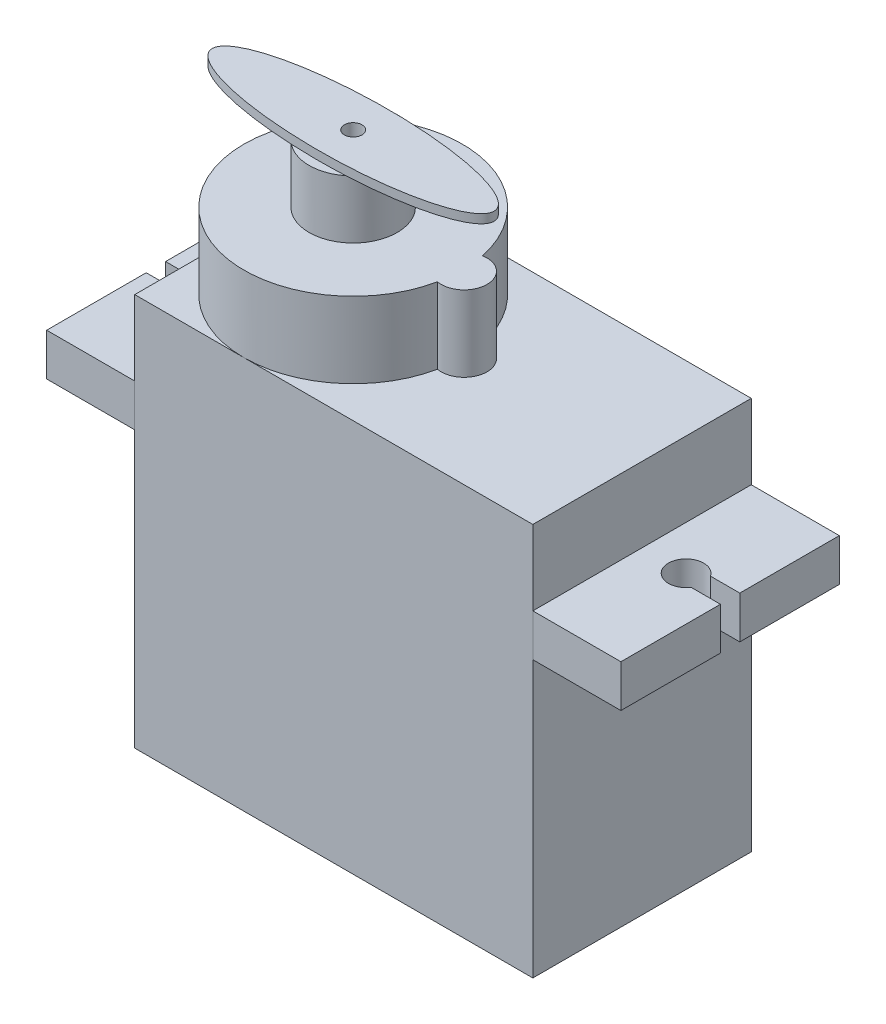
ISO-10303-21;
HEADER;
FILE_DESCRIPTION(('STEP AP214'),'2;1');
FILE_NAME('part.step','',(''),(''),'','','');
FILE_SCHEMA(('AUTOMOTIVE_DESIGN { 1 0 10303 214 1 1 1 1 }'));
ENDSEC;
DATA;
#1=APPLICATION_CONTEXT('core data for automotive mechanical design processes');
#2=APPLICATION_PROTOCOL_DEFINITION('international standard','automotive_design',2000,#1);
#3=PRODUCT_CONTEXT('',#1,'mechanical');
#4=PRODUCT('Part','Part','',(#3));
#5=PRODUCT_RELATED_PRODUCT_CATEGORY('part','',(#4));
#6=PRODUCT_DEFINITION_FORMATION('','',#4);
#7=PRODUCT_DEFINITION_CONTEXT('part definition',#1,'design');
#8=PRODUCT_DEFINITION('design','',#6,#7);
#9=PRODUCT_DEFINITION_SHAPE('','',#8);
#10=(LENGTH_UNIT() NAMED_UNIT(*) SI_UNIT(.MILLI.,.METRE.));
#11=(NAMED_UNIT(*) PLANE_ANGLE_UNIT() SI_UNIT($,.RADIAN.));
#12=(NAMED_UNIT(*) SI_UNIT($,.STERADIAN.) SOLID_ANGLE_UNIT());
#13=UNCERTAINTY_MEASURE_WITH_UNIT(LENGTH_MEASURE(1.E-05),#10,'distance_accuracy_value','');
#14=(GEOMETRIC_REPRESENTATION_CONTEXT(3) GLOBAL_UNCERTAINTY_ASSIGNED_CONTEXT((#13)) GLOBAL_UNIT_ASSIGNED_CONTEXT((#10,
#11,#12)) REPRESENTATION_CONTEXT('',''));
#15=CARTESIAN_POINT('',(0.,0.,0.));
#16=DIRECTION('',(0.,0.,1.));
#17=DIRECTION('',(1.,0.,0.));
#18=AXIS2_PLACEMENT_3D('',#15,#16,#17);
#19=CARTESIAN_POINT('',(-13.6,4.5,1.2));
#20=DIRECTION('',(1.,0.,0.));
#21=DIRECTION('',(0.,0.,-1.));
#22=AXIS2_PLACEMENT_3D('',#19,#20,#21);
#23=CYLINDRICAL_SURFACE('',#22,0.6);
#24=CARTESIAN_POINT('',(-13.6,4.5,1.2));
#25=DIRECTION('',(-1.,0.,0.));
#26=DIRECTION('',(0.,0.,1.));
#27=AXIS2_PLACEMENT_3D('',#24,#25,#26);
#28=CIRCLE('',#27,0.6);
#29=CARTESIAN_POINT('',(-13.6,4.5,1.8));
#30=VERTEX_POINT('',#29);
#31=EDGE_CURVE('E12',#30,#30,#28,.T.);
#32=ORIENTED_EDGE('',*,*,#31,.F.);
#33=EDGE_LOOP('',(#32));
#34=FACE_BOUND('',#33,.T.);
#35=CARTESIAN_POINT('',(-11.3,4.5,1.2));
#36=DIRECTION('',(-1.,0.,0.));
#37=DIRECTION('',(0.,0.,1.));
#38=AXIS2_PLACEMENT_3D('',#35,#36,#37);
#39=CIRCLE('',#38,0.6);
#40=CARTESIAN_POINT('',(-11.3,4.5,1.8));
#41=VERTEX_POINT('',#40);
#42=EDGE_CURVE('E54',#41,#41,#39,.T.);
#43=ORIENTED_EDGE('',*,*,#42,.T.);
#44=EDGE_LOOP('',(#43));
#45=FACE_BOUND('',#44,.T.);
#46=ADVANCED_FACE('F51',(#34,#45),#23,.T.);
#47=CARTESIAN_POINT('',(-13.6,0.,0.));
#48=DIRECTION('',(-1.,0.,0.));
#49=DIRECTION('',(0.,0.,1.));
#50=AXIS2_PLACEMENT_3D('',#47,#48,#49);
#51=PLANE('',#50);
#52=ORIENTED_EDGE('',*,*,#31,.T.);
#53=EDGE_LOOP('',(#52));
#54=FACE_BOUND('',#53,.T.);
#55=ADVANCED_FACE('F66',(#54),#51,.T.);
#56=CARTESIAN_POINT('',(-11.3,0.,0.));
#57=DIRECTION('',(-1.,0.,0.));
#58=DIRECTION('',(0.,0.,1.));
#59=AXIS2_PLACEMENT_3D('',#56,#57,#58);
#60=PLANE('',#59);
#61=ORIENTED_EDGE('',*,*,#42,.F.);
#62=EDGE_LOOP('',(#61));
#63=FACE_BOUND('',#62,.T.);
#64=ADVANCED_FACE('F64',(#63),#60,.F.);
#65=CLOSED_SHELL('',(#46,#55,#64));
#66=MANIFOLD_SOLID_BREP('B2',#65);
#67=CARTESIAN_POINT('',(-13.6,4.5,-1.2));
#68=DIRECTION('',(1.,0.,0.));
#69=DIRECTION('',(0.,0.,-1.));
#70=AXIS2_PLACEMENT_3D('',#67,#68,#69);
#71=CYLINDRICAL_SURFACE('',#70,0.6);
#72=CARTESIAN_POINT('',(-13.6,4.5,-1.2));
#73=DIRECTION('',(-1.,0.,0.));
#74=DIRECTION('',(0.,0.,1.));
#75=AXIS2_PLACEMENT_3D('',#72,#73,#74);
#76=CIRCLE('',#75,0.6);
#77=CARTESIAN_POINT('',(-13.6,4.5,-0.600000000000001));
#78=VERTEX_POINT('',#77);
#79=EDGE_CURVE('E50',#78,#78,#76,.T.);
#80=ORIENTED_EDGE('',*,*,#79,.F.);
#81=EDGE_LOOP('',(#80));
#82=FACE_BOUND('',#81,.T.);
#83=CARTESIAN_POINT('',(-11.3,4.5,-1.2));
#84=DIRECTION('',(-1.,0.,0.));
#85=DIRECTION('',(0.,0.,1.));
#86=AXIS2_PLACEMENT_3D('',#83,#84,#85);
#87=CIRCLE('',#86,0.6);
#88=CARTESIAN_POINT('',(-11.3,4.5,-0.600000000000001));
#89=VERTEX_POINT('',#88);
#90=EDGE_CURVE('E106',#89,#89,#87,.T.);
#91=ORIENTED_EDGE('',*,*,#90,.T.);
#92=EDGE_LOOP('',(#91));
#93=FACE_BOUND('',#92,.T.);
#94=ADVANCED_FACE('F103',(#82,#93),#71,.T.);
#95=CARTESIAN_POINT('',(-13.6,0.,0.));
#96=DIRECTION('',(-1.,0.,0.));
#97=DIRECTION('',(0.,0.,1.));
#98=AXIS2_PLACEMENT_3D('',#95,#96,#97);
#99=PLANE('',#98);
#100=ORIENTED_EDGE('',*,*,#79,.T.);
#101=EDGE_LOOP('',(#100));
#102=FACE_BOUND('',#101,.T.);
#103=ADVANCED_FACE('F118',(#102),#99,.T.);
#104=CARTESIAN_POINT('',(-11.3,0.,0.));
#105=DIRECTION('',(-1.,0.,0.));
#106=DIRECTION('',(0.,0.,1.));
#107=AXIS2_PLACEMENT_3D('',#104,#105,#106);
#108=PLANE('',#107);
#109=ORIENTED_EDGE('',*,*,#90,.F.);
#110=EDGE_LOOP('',(#109));
#111=FACE_BOUND('',#110,.T.);
#112=ADVANCED_FACE('F116',(#111),#108,.F.);
#113=CLOSED_SHELL('',(#94,#103,#112));
#114=MANIFOLD_SOLID_BREP('B7',#113);
#115=CARTESIAN_POINT('',(-13.6,4.5,0.));
#116=DIRECTION('',(1.,0.,0.));
#117=DIRECTION('',(0.,0.,-1.));
#118=AXIS2_PLACEMENT_3D('',#115,#116,#117);
#119=CYLINDRICAL_SURFACE('',#118,0.6);
#120=CARTESIAN_POINT('',(-13.6,4.5,0.));
#121=DIRECTION('',(-1.,0.,0.));
#122=DIRECTION('',(0.,0.,1.));
#123=AXIS2_PLACEMENT_3D('',#120,#121,#122);
#124=CIRCLE('',#123,0.6);
#125=CARTESIAN_POINT('',(-13.6,4.5,0.599999999999999));
#126=VERTEX_POINT('',#125);
#127=EDGE_CURVE('E102',#126,#126,#124,.T.);
#128=ORIENTED_EDGE('',*,*,#127,.F.);
#129=EDGE_LOOP('',(#128));
#130=FACE_BOUND('',#129,.T.);
#131=CARTESIAN_POINT('',(-11.3,4.5,0.));
#132=DIRECTION('',(-1.,0.,0.));
#133=DIRECTION('',(0.,0.,1.));
#134=AXIS2_PLACEMENT_3D('',#131,#132,#133);
#135=CIRCLE('',#134,0.6);
#136=CARTESIAN_POINT('',(-11.3,4.5,0.599999999999999));
#137=VERTEX_POINT('',#136);
#138=EDGE_CURVE('E160',#137,#137,#135,.T.);
#139=ORIENTED_EDGE('',*,*,#138,.T.);
#140=EDGE_LOOP('',(#139));
#141=FACE_BOUND('',#140,.T.);
#142=ADVANCED_FACE('F157',(#130,#141),#119,.T.);
#143=CARTESIAN_POINT('',(-13.6,0.,0.));
#144=DIRECTION('',(-1.,0.,0.));
#145=DIRECTION('',(0.,0.,1.));
#146=AXIS2_PLACEMENT_3D('',#143,#144,#145);
#147=PLANE('',#146);
#148=ORIENTED_EDGE('',*,*,#127,.T.);
#149=EDGE_LOOP('',(#148));
#150=FACE_BOUND('',#149,.T.);
#151=ADVANCED_FACE('F172',(#150),#147,.T.);
#152=CARTESIAN_POINT('',(-11.3,0.,0.));
#153=DIRECTION('',(-1.,0.,0.));
#154=DIRECTION('',(0.,0.,1.));
#155=AXIS2_PLACEMENT_3D('',#152,#153,#154);
#156=PLANE('',#155);
#157=ORIENTED_EDGE('',*,*,#138,.F.);
#158=EDGE_LOOP('',(#157));
#159=FACE_BOUND('',#158,.T.);
#160=ADVANCED_FACE('F170',(#159),#156,.F.);
#161=CLOSED_SHELL('',(#142,#151,#160));
#162=MANIFOLD_SOLID_BREP('B45',#161);
#163=CARTESIAN_POINT('',(-16.3,0.,0.));
#164=DIRECTION('',(-1.,0.,0.));
#165=DIRECTION('',(0.,0.,1.));
#166=AXIS2_PLACEMENT_3D('',#163,#164,#165);
#167=PLANE('',#166);
#168=DIRECTION('',(0.,1.,0.));
#169=VECTOR('',#168,1.);
#170=CARTESIAN_POINT('',(-16.3,-0.001000000000001,-0.55));
#171=LINE('',#170,#169);
#172=CARTESIAN_POINT('',(-16.3,15.65,-0.55));
#173=VERTEX_POINT('',#172);
#174=CARTESIAN_POINT('',(-16.3,18.05,-0.55));
#175=VERTEX_POINT('',#174);
#176=EDGE_CURVE('E341',#173,#175,#171,.T.);
#177=ORIENTED_EDGE('',*,*,#176,.T.);
#178=DIRECTION('',(0.,0.,-1.));
#179=VECTOR('',#178,1.);
#180=CARTESIAN_POINT('',(-16.3,18.05,6.2));
#181=LINE('',#180,#179);
#182=CARTESIAN_POINT('',(-16.3,18.05,-6.2));
#183=VERTEX_POINT('',#182);
#184=EDGE_CURVE('E264',#175,#183,#181,.T.);
#185=ORIENTED_EDGE('',*,*,#184,.T.);
#186=DIRECTION('',(0.,-1.,0.));
#187=VECTOR('',#186,1.);
#188=CARTESIAN_POINT('',(-16.3,18.05,-6.2));
#189=LINE('',#188,#187);
#190=CARTESIAN_POINT('',(-16.3,15.65,-6.2));
#191=VERTEX_POINT('',#190);
#192=EDGE_CURVE('E303',#183,#191,#189,.T.);
#193=ORIENTED_EDGE('',*,*,#192,.T.);
#194=DIRECTION('',(0.,0.,1.));
#195=VECTOR('',#194,1.);
#196=CARTESIAN_POINT('',(-16.3,15.65,-6.2));
#197=LINE('',#196,#195);
#198=EDGE_CURVE('E309',#191,#173,#197,.T.);
#199=ORIENTED_EDGE('',*,*,#198,.T.);
#200=EDGE_LOOP('',(#177,#185,#193,#199));
#201=FACE_BOUND('',#200,.T.);
#202=ADVANCED_FACE('F211',(#201),#167,.T.);
#203=CARTESIAN_POINT('',(-16.3,18.05,6.2));
#204=DIRECTION('',(0.,-1.,0.));
#205=DIRECTION('',(0.,0.,-1.));
#206=AXIS2_PLACEMENT_3D('',#203,#204,#205);
#207=PLANE('',#206);
#208=ORIENTED_EDGE('',*,*,#184,.F.);
#209=DIRECTION('',(-1.,0.,0.));
#210=VECTOR('',#209,1.);
#211=CARTESIAN_POINT('',(-16.3,18.05,-0.55));
#212=LINE('',#211,#210);
#213=CARTESIAN_POINT('',(-14.6351646544245,18.05,-0.55));
#214=VERTEX_POINT('',#213);
#215=EDGE_CURVE('E292',#214,#175,#212,.T.);
#216=ORIENTED_EDGE('',*,*,#215,.F.);
#217=CARTESIAN_POINT('',(-13.8,18.05,0.));
#218=DIRECTION('',(0.,1.,0.));
#219=DIRECTION('',(0.,0.,1.));
#220=AXIS2_PLACEMENT_3D('',#217,#218,#219);
#221=CIRCLE('',#220,1.);
#222=CARTESIAN_POINT('',(-14.6351646544245,18.05,0.55));
#223=VERTEX_POINT('',#222);
#224=EDGE_CURVE('E299',#223,#214,#221,.T.);
#225=ORIENTED_EDGE('',*,*,#224,.F.);
#226=DIRECTION('',(1.,0.,0.));
#227=VECTOR('',#226,1.);
#228=CARTESIAN_POINT('',(-16.3,18.05,0.55));
#229=LINE('',#228,#227);
#230=CARTESIAN_POINT('',(-16.3,18.05,0.55));
#231=VERTEX_POINT('',#230);
#232=EDGE_CURVE('E288',#231,#223,#229,.T.);
#233=ORIENTED_EDGE('',*,*,#232,.F.);
#234=CARTESIAN_POINT('',(-16.3,18.05,6.2));
#235=VERTEX_POINT('',#234);
#236=EDGE_CURVE('E296',#235,#231,#181,.T.);
#237=ORIENTED_EDGE('',*,*,#236,.F.);
#238=DIRECTION('',(1.,0.,0.));
#239=VECTOR('',#238,1.);
#240=CARTESIAN_POINT('',(-16.3,18.05,6.2));
#241=LINE('',#240,#239);
#242=CARTESIAN_POINT('',(-11.3,18.05,6.2));
#243=VERTEX_POINT('',#242);
#244=EDGE_CURVE('E313',#235,#243,#241,.T.);
#245=ORIENTED_EDGE('',*,*,#244,.T.);
#246=DIRECTION('',(0.,0.,-1.));
#247=VECTOR('',#246,1.);
#248=CARTESIAN_POINT('',(-11.3,18.05,6.2));
#249=LINE('',#248,#247);
#250=CARTESIAN_POINT('',(-11.3,18.05,-6.2));
#251=VERTEX_POINT('',#250);
#252=EDGE_CURVE('E314',#243,#251,#249,.T.);
#253=ORIENTED_EDGE('',*,*,#252,.T.);
#254=DIRECTION('',(1.,0.,0.));
#255=VECTOR('',#254,1.);
#256=CARTESIAN_POINT('',(-16.3,18.05,-6.2));
#257=LINE('',#256,#255);
#258=EDGE_CURVE('E155',#183,#251,#257,.T.);
#259=ORIENTED_EDGE('',*,*,#258,.F.);
#260=EDGE_LOOP('',(#208,#216,#225,#233,#237,#245,#253,#259));
#261=FACE_BOUND('',#260,.T.);
#262=ADVANCED_FACE('F213',(#261),#207,.F.);
#263=CARTESIAN_POINT('',(-16.3,18.05,-6.2));
#264=DIRECTION('',(0.,0.,1.));
#265=DIRECTION('',(1.,0.,0.));
#266=AXIS2_PLACEMENT_3D('',#263,#264,#265);
#267=PLANE('',#266);
#268=DIRECTION('',(0.,-1.,0.));
#269=VECTOR('',#268,1.);
#270=CARTESIAN_POINT('',(-11.3,18.05,-6.2));
#271=LINE('',#270,#269);
#272=CARTESIAN_POINT('',(-11.3,15.65,-6.2));
#273=VERTEX_POINT('',#272);
#274=EDGE_CURVE('E317',#251,#273,#271,.T.);
#275=ORIENTED_EDGE('',*,*,#274,.T.);
#276=DIRECTION('',(1.,0.,0.));
#277=VECTOR('',#276,1.);
#278=CARTESIAN_POINT('',(-16.3,15.65,-6.2));
#279=LINE('',#278,#277);
#280=EDGE_CURVE('E219',#191,#273,#279,.T.);
#281=ORIENTED_EDGE('',*,*,#280,.F.);
#282=ORIENTED_EDGE('',*,*,#192,.F.);
#283=ORIENTED_EDGE('',*,*,#258,.T.);
#284=EDGE_LOOP('',(#275,#281,#282,#283));
#285=FACE_BOUND('',#284,.T.);
#286=ADVANCED_FACE('F355',(#285),#267,.F.);
#287=CARTESIAN_POINT('',(-16.3,15.65,-6.2));
#288=DIRECTION('',(0.,1.,0.));
#289=DIRECTION('',(0.,0.,1.));
#290=AXIS2_PLACEMENT_3D('',#287,#288,#289);
#291=PLANE('',#290);
#292=CARTESIAN_POINT('',(-13.8,15.65,0.));
#293=DIRECTION('',(0.,1.,0.));
#294=DIRECTION('',(0.,0.,1.));
#295=AXIS2_PLACEMENT_3D('',#292,#293,#294);
#296=CIRCLE('',#295,1.);
#297=CARTESIAN_POINT('',(-14.6351646544245,15.65,-0.55));
#298=VERTEX_POINT('',#297);
#299=CARTESIAN_POINT('',(-14.6351646544245,15.65,0.55));
#300=VERTEX_POINT('',#299);
#301=EDGE_CURVE('E340',#298,#300,#296,.F.);
#302=ORIENTED_EDGE('',*,*,#301,.F.);
#303=DIRECTION('',(1.,0.,0.));
#304=VECTOR('',#303,1.);
#305=CARTESIAN_POINT('',(-16.3,15.65,-0.55));
#306=LINE('',#305,#304);
#307=EDGE_CURVE('E300',#173,#298,#306,.T.);
#308=ORIENTED_EDGE('',*,*,#307,.F.);
#309=ORIENTED_EDGE('',*,*,#198,.F.);
#310=ORIENTED_EDGE('',*,*,#280,.T.);
#311=DIRECTION('',(0.,0.,1.));
#312=VECTOR('',#311,1.);
#313=CARTESIAN_POINT('',(-11.3,15.65,-6.2));
#314=LINE('',#313,#312);
#315=CARTESIAN_POINT('',(-11.3,15.65,6.2));
#316=VERTEX_POINT('',#315);
#317=EDGE_CURVE('E319',#273,#316,#314,.T.);
#318=ORIENTED_EDGE('',*,*,#317,.T.);
#319=DIRECTION('',(1.,0.,0.));
#320=VECTOR('',#319,1.);
#321=CARTESIAN_POINT('',(-16.3,15.65,6.2));
#322=LINE('',#321,#320);
#323=CARTESIAN_POINT('',(-16.3,15.65,6.2));
#324=VERTEX_POINT('',#323);
#325=EDGE_CURVE('E323',#324,#316,#322,.T.);
#326=ORIENTED_EDGE('',*,*,#325,.F.);
#327=CARTESIAN_POINT('',(-16.3,15.65,0.549999999999997));
#328=VERTEX_POINT('',#327);
#329=EDGE_CURVE('E305',#328,#324,#197,.T.);
#330=ORIENTED_EDGE('',*,*,#329,.F.);
#331=DIRECTION('',(-1.,0.,0.));
#332=VECTOR('',#331,1.);
#333=CARTESIAN_POINT('',(-16.3,15.65,0.55));
#334=LINE('',#333,#332);
#335=EDGE_CURVE('E226',#300,#328,#334,.T.);
#336=ORIENTED_EDGE('',*,*,#335,.F.);
#337=EDGE_LOOP('',(#302,#308,#309,#310,#318,#326,#330,#336));
#338=FACE_BOUND('',#337,.T.);
#339=ADVANCED_FACE('F330',(#338),#291,.F.);
#340=CARTESIAN_POINT('',(-16.3,15.65,6.2));
#341=DIRECTION('',(0.,0.,-1.));
#342=DIRECTION('',(-1.,0.,0.));
#343=AXIS2_PLACEMENT_3D('',#340,#341,#342);
#344=PLANE('',#343);
#345=DIRECTION('',(0.,1.,0.));
#346=VECTOR('',#345,1.);
#347=CARTESIAN_POINT('',(-11.3,15.65,6.2));
#348=LINE('',#347,#346);
#349=EDGE_CURVE('E256',#316,#243,#348,.T.);
#350=ORIENTED_EDGE('',*,*,#349,.T.);
#351=ORIENTED_EDGE('',*,*,#244,.F.);
#352=DIRECTION('',(0.,1.,0.));
#353=VECTOR('',#352,1.);
#354=CARTESIAN_POINT('',(-16.3,15.65,6.2));
#355=LINE('',#354,#353);
#356=EDGE_CURVE('E235',#324,#235,#355,.T.);
#357=ORIENTED_EDGE('',*,*,#356,.F.);
#358=ORIENTED_EDGE('',*,*,#325,.T.);
#359=EDGE_LOOP('',(#350,#351,#357,#358));
#360=FACE_BOUND('',#359,.T.);
#361=ADVANCED_FACE('F338',(#360),#344,.F.);
#362=DIRECTION('',(0.,1.,0.));
#363=VECTOR('',#362,1.);
#364=CARTESIAN_POINT('',(-16.3,-0.001000000000001,0.55));
#365=LINE('',#364,#363);
#366=EDGE_CURVE('E285',#328,#231,#365,.T.);
#367=ORIENTED_EDGE('',*,*,#366,.F.);
#368=ORIENTED_EDGE('',*,*,#329,.T.);
#369=ORIENTED_EDGE('',*,*,#356,.T.);
#370=ORIENTED_EDGE('',*,*,#236,.T.);
#371=EDGE_LOOP('',(#367,#368,#369,#370));
#372=FACE_BOUND('',#371,.T.);
#373=ADVANCED_FACE('F302',(#372),#167,.T.);
#374=CARTESIAN_POINT('',(-11.3,0.,0.));
#375=DIRECTION('',(-1.,0.,0.));
#376=DIRECTION('',(0.,0.,1.));
#377=AXIS2_PLACEMENT_3D('',#374,#375,#376);
#378=PLANE('',#377);
#379=ORIENTED_EDGE('',*,*,#252,.F.);
#380=ORIENTED_EDGE('',*,*,#349,.F.);
#381=ORIENTED_EDGE('',*,*,#317,.F.);
#382=ORIENTED_EDGE('',*,*,#274,.F.);
#383=EDGE_LOOP('',(#379,#380,#381,#382));
#384=FACE_BOUND('',#383,.T.);
#385=ADVANCED_FACE('F336',(#384),#378,.F.);
#386=CARTESIAN_POINT('',(-16.3,-0.001000000000001,-0.55));
#387=DIRECTION('',(0.,0.,-1.));
#388=DIRECTION('',(-1.,0.,0.));
#389=AXIS2_PLACEMENT_3D('',#386,#387,#388);
#390=PLANE('',#389);
#391=ORIENTED_EDGE('',*,*,#307,.T.);
#392=DIRECTION('',(0.,1.,0.));
#393=VECTOR('',#392,1.);
#394=CARTESIAN_POINT('',(-14.6351646544245,-0.001000000000001,-0.55));
#395=LINE('',#394,#393);
#396=EDGE_CURVE('E342',#298,#214,#395,.T.);
#397=ORIENTED_EDGE('',*,*,#396,.T.);
#398=ORIENTED_EDGE('',*,*,#215,.T.);
#399=ORIENTED_EDGE('',*,*,#176,.F.);
#400=EDGE_LOOP('',(#391,#397,#398,#399));
#401=FACE_BOUND('',#400,.T.);
#402=ADVANCED_FACE('F354',(#401),#390,.F.);
#403=CARTESIAN_POINT('',(-13.8,-0.001000000000001,0.));
#404=DIRECTION('',(0.,1.,0.));
#405=DIRECTION('',(0.,0.,1.));
#406=AXIS2_PLACEMENT_3D('',#403,#404,#405);
#407=CYLINDRICAL_SURFACE('',#406,1.);
#408=ORIENTED_EDGE('',*,*,#301,.T.);
#409=DIRECTION('',(0.,1.,0.));
#410=VECTOR('',#409,1.);
#411=CARTESIAN_POINT('',(-14.6351646544245,-0.001000000000001,0.55));
#412=LINE('',#411,#410);
#413=EDGE_CURVE('E291',#300,#223,#412,.T.);
#414=ORIENTED_EDGE('',*,*,#413,.T.);
#415=ORIENTED_EDGE('',*,*,#224,.T.);
#416=ORIENTED_EDGE('',*,*,#396,.F.);
#417=EDGE_LOOP('',(#408,#414,#415,#416));
#418=FACE_BOUND('',#417,.T.);
#419=ADVANCED_FACE('F349',(#418),#407,.F.);
#420=CARTESIAN_POINT('',(-16.3,-0.001000000000001,0.55));
#421=DIRECTION('',(0.,0.,1.));
#422=DIRECTION('',(1.,0.,0.));
#423=AXIS2_PLACEMENT_3D('',#420,#421,#422);
#424=PLANE('',#423);
#425=ORIENTED_EDGE('',*,*,#335,.T.);
#426=ORIENTED_EDGE('',*,*,#366,.T.);
#427=ORIENTED_EDGE('',*,*,#232,.T.);
#428=ORIENTED_EDGE('',*,*,#413,.F.);
#429=EDGE_LOOP('',(#425,#426,#427,#428));
#430=FACE_BOUND('',#429,.T.);
#431=ADVANCED_FACE('F287',(#430),#424,.F.);
#432=CLOSED_SHELL('',(#202,#262,#286,#339,#361,#373,#385,#402,#419,#431));
#433=MANIFOLD_SOLID_BREP('B97',#432);
#434=CARTESIAN_POINT('',(16.3,15.65,6.2));
#435=DIRECTION('',(0.,1.,0.));
#436=DIRECTION('',(0.,0.,1.));
#437=AXIS2_PLACEMENT_3D('',#434,#435,#436);
#438=PLANE('',#437);
#439=DIRECTION('',(-1.,0.,0.));
#440=VECTOR('',#439,1.);
#441=CARTESIAN_POINT('',(14.6351646544245,15.65,-0.55));
#442=LINE('',#441,#440);
#443=CARTESIAN_POINT('',(16.3,15.65,-0.55));
#444=VERTEX_POINT('',#443);
#445=CARTESIAN_POINT('',(14.6351646544245,15.65,-0.55));
#446=VERTEX_POINT('',#445);
#447=EDGE_CURVE('E536',#444,#446,#442,.T.);
#448=ORIENTED_EDGE('',*,*,#447,.T.);
#449=CARTESIAN_POINT('',(13.8,15.65,0.));
#450=DIRECTION('',(0.,1.,0.));
#451=DIRECTION('',(0.,0.,1.));
#452=AXIS2_PLACEMENT_3D('',#449,#450,#451);
#453=CIRCLE('',#452,1.);
#454=CARTESIAN_POINT('',(14.6351646544245,15.65,0.55));
#455=VERTEX_POINT('',#454);
#456=EDGE_CURVE('E523',#455,#446,#453,.F.);
#457=ORIENTED_EDGE('',*,*,#456,.F.);
#458=DIRECTION('',(-1.,0.,0.));
#459=VECTOR('',#458,1.);
#460=CARTESIAN_POINT('',(14.6351646544245,15.65,0.55));
#461=LINE('',#460,#459);
#462=CARTESIAN_POINT('',(16.3,15.65,0.55));
#463=VERTEX_POINT('',#462);
#464=EDGE_CURVE('E530',#463,#455,#461,.T.);
#465=ORIENTED_EDGE('',*,*,#464,.F.);
#466=DIRECTION('',(0.,0.,-1.));
#467=VECTOR('',#466,1.);
#468=CARTESIAN_POINT('',(16.3,15.65,6.2));
#469=LINE('',#468,#467);
#470=CARTESIAN_POINT('',(16.3,15.65,6.2));
#471=VERTEX_POINT('',#470);
#472=EDGE_CURVE('E496',#471,#463,#469,.T.);
#473=ORIENTED_EDGE('',*,*,#472,.F.);
#474=DIRECTION('',(-1.,0.,0.));
#475=VECTOR('',#474,1.);
#476=CARTESIAN_POINT('',(16.3,15.65,6.2));
#477=LINE('',#476,#475);
#478=CARTESIAN_POINT('',(11.3,15.65,6.2));
#479=VERTEX_POINT('',#478);
#480=EDGE_CURVE('E209',#471,#479,#477,.T.);
#481=ORIENTED_EDGE('',*,*,#480,.T.);
#482=DIRECTION('',(0.,0.,-1.));
#483=VECTOR('',#482,1.);
#484=CARTESIAN_POINT('',(11.3,15.65,6.2));
#485=LINE('',#484,#483);
#486=CARTESIAN_POINT('',(11.3,15.65,-6.2));
#487=VERTEX_POINT('',#486);
#488=EDGE_CURVE('E560',#479,#487,#485,.T.);
#489=ORIENTED_EDGE('',*,*,#488,.T.);
#490=DIRECTION('',(-1.,0.,0.));
#491=VECTOR('',#490,1.);
#492=CARTESIAN_POINT('',(16.3,15.65,-6.2));
#493=LINE('',#492,#491);
#494=CARTESIAN_POINT('',(16.3,15.65,-6.2));
#495=VERTEX_POINT('',#494);
#496=EDGE_CURVE('E452',#495,#487,#493,.T.);
#497=ORIENTED_EDGE('',*,*,#496,.F.);
#498=EDGE_CURVE('E550',#444,#495,#469,.T.);
#499=ORIENTED_EDGE('',*,*,#498,.F.);
#500=EDGE_LOOP('',(#448,#457,#465,#473,#481,#489,#497,#499));
#501=FACE_BOUND('',#500,.T.);
#502=ADVANCED_FACE('F444',(#501),#438,.F.);
#503=CARTESIAN_POINT('',(16.3,18.05,6.2));
#504=DIRECTION('',(0.,-1.,0.));
#505=DIRECTION('',(0.,0.,-1.));
#506=AXIS2_PLACEMENT_3D('',#503,#504,#505);
#507=PLANE('',#506);
#508=DIRECTION('',(1.,0.,0.));
#509=VECTOR('',#508,1.);
#510=CARTESIAN_POINT('',(14.6351646544245,18.05,-0.55));
#511=LINE('',#510,#509);
#512=CARTESIAN_POINT('',(14.6351646544245,18.05,-0.55));
#513=VERTEX_POINT('',#512);
#514=CARTESIAN_POINT('',(16.3,18.05,-0.55));
#515=VERTEX_POINT('',#514);
#516=EDGE_CURVE('E528',#513,#515,#511,.T.);
#517=ORIENTED_EDGE('',*,*,#516,.T.);
#518=DIRECTION('',(0.,0.,1.));
#519=VECTOR('',#518,1.);
#520=CARTESIAN_POINT('',(16.3,18.05,6.2));
#521=LINE('',#520,#519);
#522=CARTESIAN_POINT('',(16.3,18.05,-6.2));
#523=VERTEX_POINT('',#522);
#524=EDGE_CURVE('E554',#523,#515,#521,.T.);
#525=ORIENTED_EDGE('',*,*,#524,.F.);
#526=DIRECTION('',(-1.,0.,0.));
#527=VECTOR('',#526,1.);
#528=CARTESIAN_POINT('',(16.3,18.05,-6.2));
#529=LINE('',#528,#527);
#530=CARTESIAN_POINT('',(11.3,18.05,-6.2));
#531=VERTEX_POINT('',#530);
#532=EDGE_CURVE('E566',#523,#531,#529,.T.);
#533=ORIENTED_EDGE('',*,*,#532,.T.);
#534=DIRECTION('',(0.,0.,1.));
#535=VECTOR('',#534,1.);
#536=CARTESIAN_POINT('',(11.3,18.05,6.2));
#537=LINE('',#536,#535);
#538=CARTESIAN_POINT('',(11.3,18.05,6.2));
#539=VERTEX_POINT('',#538);
#540=EDGE_CURVE('E489',#531,#539,#537,.T.);
#541=ORIENTED_EDGE('',*,*,#540,.T.);
#542=DIRECTION('',(-1.,0.,0.));
#543=VECTOR('',#542,1.);
#544=CARTESIAN_POINT('',(16.3,18.05,6.2));
#545=LINE('',#544,#543);
#546=CARTESIAN_POINT('',(16.3,18.05,6.2));
#547=VERTEX_POINT('',#546);
#548=EDGE_CURVE('E557',#547,#539,#545,.T.);
#549=ORIENTED_EDGE('',*,*,#548,.F.);
#550=CARTESIAN_POINT('',(16.3,18.05,0.550000000000002));
#551=VERTEX_POINT('',#550);
#552=EDGE_CURVE('E467',#551,#547,#521,.T.);
#553=ORIENTED_EDGE('',*,*,#552,.F.);
#554=DIRECTION('',(1.,0.,0.));
#555=VECTOR('',#554,1.);
#556=CARTESIAN_POINT('',(14.6351646544245,18.05,0.55));
#557=LINE('',#556,#555);
#558=CARTESIAN_POINT('',(14.6351646544245,18.05,0.55));
#559=VERTEX_POINT('',#558);
#560=EDGE_CURVE('E459',#559,#551,#557,.T.);
#561=ORIENTED_EDGE('',*,*,#560,.F.);
#562=CARTESIAN_POINT('',(13.8,18.05,0.));
#563=DIRECTION('',(0.,1.,0.));
#564=DIRECTION('',(0.,0.,1.));
#565=AXIS2_PLACEMENT_3D('',#562,#563,#564);
#566=CIRCLE('',#565,1.);
#567=EDGE_CURVE('E526',#513,#559,#566,.T.);
#568=ORIENTED_EDGE('',*,*,#567,.F.);
#569=EDGE_LOOP('',(#517,#525,#533,#541,#549,#553,#561,#568));
#570=FACE_BOUND('',#569,.T.);
#571=ADVANCED_FACE('F580',(#570),#507,.F.);
#572=CARTESIAN_POINT('',(16.3,0.,0.));
#573=DIRECTION('',(1.,0.,0.));
#574=DIRECTION('',(0.,0.,-1.));
#575=AXIS2_PLACEMENT_3D('',#572,#573,#574);
#576=PLANE('',#575);
#577=ORIENTED_EDGE('',*,*,#524,.T.);
#578=DIRECTION('',(0.,1.,0.));
#579=VECTOR('',#578,1.);
#580=CARTESIAN_POINT('',(16.3,-0.001000000000001,-0.55));
#581=LINE('',#580,#579);
#582=EDGE_CURVE('E545',#444,#515,#581,.T.);
#583=ORIENTED_EDGE('',*,*,#582,.F.);
#584=ORIENTED_EDGE('',*,*,#498,.T.);
#585=DIRECTION('',(0.,1.,0.));
#586=VECTOR('',#585,1.);
#587=CARTESIAN_POINT('',(16.3,18.05,-6.2));
#588=LINE('',#587,#586);
#589=EDGE_CURVE('E552',#495,#523,#588,.T.);
#590=ORIENTED_EDGE('',*,*,#589,.T.);
#591=EDGE_LOOP('',(#577,#583,#584,#590));
#592=FACE_BOUND('',#591,.T.);
#593=ADVANCED_FACE('F586',(#592),#576,.T.);
#594=CARTESIAN_POINT('',(16.3,18.05,6.2));
#595=DIRECTION('',(0.,0.,-1.));
#596=DIRECTION('',(-1.,0.,0.));
#597=AXIS2_PLACEMENT_3D('',#594,#595,#596);
#598=PLANE('',#597);
#599=DIRECTION('',(0.,-1.,0.));
#600=VECTOR('',#599,1.);
#601=CARTESIAN_POINT('',(11.3,18.05,6.2));
#602=LINE('',#601,#600);
#603=EDGE_CURVE('E532',#539,#479,#602,.T.);
#604=ORIENTED_EDGE('',*,*,#603,.T.);
#605=ORIENTED_EDGE('',*,*,#480,.F.);
#606=DIRECTION('',(0.,-1.,0.));
#607=VECTOR('',#606,1.);
#608=CARTESIAN_POINT('',(16.3,18.05,6.2));
#609=LINE('',#608,#607);
#610=EDGE_CURVE('E548',#547,#471,#609,.T.);
#611=ORIENTED_EDGE('',*,*,#610,.F.);
#612=ORIENTED_EDGE('',*,*,#548,.T.);
#613=EDGE_LOOP('',(#604,#605,#611,#612));
#614=FACE_BOUND('',#613,.T.);
#615=ADVANCED_FACE('F446',(#614),#598,.F.);
#616=CARTESIAN_POINT('',(16.3,18.05,-6.2));
#617=DIRECTION('',(0.,0.,1.));
#618=DIRECTION('',(1.,0.,0.));
#619=AXIS2_PLACEMENT_3D('',#616,#617,#618);
#620=PLANE('',#619);
#621=DIRECTION('',(0.,1.,0.));
#622=VECTOR('',#621,1.);
#623=CARTESIAN_POINT('',(11.3,18.05,-6.2));
#624=LINE('',#623,#622);
#625=EDGE_CURVE('E562',#487,#531,#624,.T.);
#626=ORIENTED_EDGE('',*,*,#625,.T.);
#627=ORIENTED_EDGE('',*,*,#532,.F.);
#628=ORIENTED_EDGE('',*,*,#589,.F.);
#629=ORIENTED_EDGE('',*,*,#496,.T.);
#630=EDGE_LOOP('',(#626,#627,#628,#629));
#631=FACE_BOUND('',#630,.T.);
#632=ADVANCED_FACE('F572',(#631),#620,.F.);
#633=DIRECTION('',(0.,1.,0.));
#634=VECTOR('',#633,1.);
#635=CARTESIAN_POINT('',(16.3,-0.001000000000001,0.55));
#636=LINE('',#635,#634);
#637=EDGE_CURVE('E527',#463,#551,#636,.T.);
#638=ORIENTED_EDGE('',*,*,#637,.T.);
#639=ORIENTED_EDGE('',*,*,#552,.T.);
#640=ORIENTED_EDGE('',*,*,#610,.T.);
#641=ORIENTED_EDGE('',*,*,#472,.T.);
#642=EDGE_LOOP('',(#638,#639,#640,#641));
#643=FACE_BOUND('',#642,.T.);
#644=ADVANCED_FACE('F603',(#643),#576,.T.);
#645=CARTESIAN_POINT('',(11.3,0.,0.));
#646=DIRECTION('',(1.,0.,0.));
#647=DIRECTION('',(0.,0.,-1.));
#648=AXIS2_PLACEMENT_3D('',#645,#646,#647);
#649=PLANE('',#648);
#650=ORIENTED_EDGE('',*,*,#603,.F.);
#651=ORIENTED_EDGE('',*,*,#540,.F.);
#652=ORIENTED_EDGE('',*,*,#625,.F.);
#653=ORIENTED_EDGE('',*,*,#488,.F.);
#654=EDGE_LOOP('',(#650,#651,#652,#653));
#655=FACE_BOUND('',#654,.T.);
#656=ADVANCED_FACE('F576',(#655),#649,.F.);
#657=CARTESIAN_POINT('',(13.8,-0.001000000000001,0.));
#658=DIRECTION('',(0.,1.,0.));
#659=DIRECTION('',(0.,0.,1.));
#660=AXIS2_PLACEMENT_3D('',#657,#658,#659);
#661=CYLINDRICAL_SURFACE('',#660,1.);
#662=ORIENTED_EDGE('',*,*,#456,.T.);
#663=DIRECTION('',(0.,1.,0.));
#664=VECTOR('',#663,1.);
#665=CARTESIAN_POINT('',(14.6351646544245,-0.001000000000001,-0.55));
#666=LINE('',#665,#664);
#667=EDGE_CURVE('E533',#446,#513,#666,.T.);
#668=ORIENTED_EDGE('',*,*,#667,.T.);
#669=ORIENTED_EDGE('',*,*,#567,.T.);
#670=DIRECTION('',(0.,1.,0.));
#671=VECTOR('',#670,1.);
#672=CARTESIAN_POINT('',(14.6351646544245,-0.001000000000001,0.55));
#673=LINE('',#672,#671);
#674=EDGE_CURVE('E519',#455,#559,#673,.T.);
#675=ORIENTED_EDGE('',*,*,#674,.F.);
#676=EDGE_LOOP('',(#662,#668,#669,#675));
#677=FACE_BOUND('',#676,.T.);
#678=ADVANCED_FACE('F521',(#677),#661,.F.);
#679=CARTESIAN_POINT('',(14.6351646544245,-0.001000000000001,-0.55));
#680=DIRECTION('',(0.,0.,1.));
#681=DIRECTION('',(1.,0.,0.));
#682=AXIS2_PLACEMENT_3D('',#679,#680,#681);
#683=PLANE('',#682);
#684=ORIENTED_EDGE('',*,*,#582,.T.);
#685=ORIENTED_EDGE('',*,*,#516,.F.);
#686=ORIENTED_EDGE('',*,*,#667,.F.);
#687=ORIENTED_EDGE('',*,*,#447,.F.);
#688=EDGE_LOOP('',(#684,#685,#686,#687));
#689=FACE_BOUND('',#688,.T.);
#690=ADVANCED_FACE('F587',(#689),#683,.T.);
#691=CARTESIAN_POINT('',(14.6351646544245,-0.001000000000001,0.55));
#692=DIRECTION('',(0.,0.,1.));
#693=DIRECTION('',(1.,0.,0.));
#694=AXIS2_PLACEMENT_3D('',#691,#692,#693);
#695=PLANE('',#694);
#696=ORIENTED_EDGE('',*,*,#464,.T.);
#697=ORIENTED_EDGE('',*,*,#674,.T.);
#698=ORIENTED_EDGE('',*,*,#560,.T.);
#699=ORIENTED_EDGE('',*,*,#637,.F.);
#700=EDGE_LOOP('',(#696,#697,#698,#699));
#701=FACE_BOUND('',#700,.T.);
#702=ADVANCED_FACE('F531',(#701),#695,.F.);
#703=CLOSED_SHELL('',(#502,#571,#593,#615,#632,#644,#656,#678,#690,#702));
#704=MANIFOLD_SOLID_BREP('B149',#703);
#705=CARTESIAN_POINT('',(-5.1,29.9,0.));
#706=DIRECTION('',(0.,1.,0.));
#707=DIRECTION('',(0.,0.,1.));
#708=AXIS2_PLACEMENT_3D('',#705,#706,#707);
#709=PLANE('',#708);
#710=CARTESIAN_POINT('',(-5.1,29.9,0.));
#711=DIRECTION('',(0.,1.,0.));
#712=DIRECTION('',(1.,0.,0.));
#713=AXIS2_PLACEMENT_3D('',#710,#711,#712);
#714=ELLIPSE('',#713,7.99881895058398,2.);
#715=CARTESIAN_POINT('',(-3.55079141063231,29.9,-1.9621296457241));
#716=VERTEX_POINT('',#715);
#717=CARTESIAN_POINT('',(-6.64920858936769,29.9,-1.9621296457241));
#718=VERTEX_POINT('',#717);
#719=EDGE_CURVE('E679',#716,#718,#714,.T.);
#720=ORIENTED_EDGE('',*,*,#719,.F.);
#721=CARTESIAN_POINT('',(-5.1,29.9,0.));
#722=DIRECTION('',(0.,1.,0.));
#723=DIRECTION('',(0.,0.,1.));
#724=AXIS2_PLACEMENT_3D('',#721,#722,#723);
#725=CIRCLE('',#724,2.5);
#726=EDGE_CURVE('E748',#716,#718,#725,.T.);
#727=ORIENTED_EDGE('',*,*,#726,.T.);
#728=EDGE_LOOP('',(#720,#727));
#729=FACE_BOUND('',#728,.T.);
#730=ADVANCED_FACE('F668',(#729),#709,.T.);
#731=CARTESIAN_POINT('',(0.,22.3,0.));
#732=DIRECTION('',(0.,-1.,0.));
#733=DIRECTION('',(0.,0.,-1.));
#734=AXIS2_PLACEMENT_3D('',#731,#732,#733);
#735=PLANE('',#734);
#736=CARTESIAN_POINT('',(1.2,22.3,0.));
#737=DIRECTION('',(0.,1.,0.));
#738=DIRECTION('',(0.,0.,1.));
#739=AXIS2_PLACEMENT_3D('',#736,#737,#738);
#740=CIRCLE('',#739,1.3);
#741=CARTESIAN_POINT('',(0.966666666666667,22.3,1.27888840621673));
#742=VERTEX_POINT('',#741);
#743=CARTESIAN_POINT('',(0.966666666666667,22.3,-1.27888840621673));
#744=VERTEX_POINT('',#743);
#745=EDGE_CURVE('E752',#742,#744,#740,.T.);
#746=ORIENTED_EDGE('',*,*,#745,.F.);
#747=CARTESIAN_POINT('',(-5.1,22.3,0.));
#748=DIRECTION('',(0.,1.,0.));
#749=DIRECTION('',(0.,0.,1.));
#750=AXIS2_PLACEMENT_3D('',#747,#748,#749);
#751=CIRCLE('',#750,6.2);
#752=CARTESIAN_POINT('',(-5.1,22.3,6.2));
#753=VERTEX_POINT('',#752);
#754=EDGE_CURVE('E783',#753,#742,#751,.T.);
#755=ORIENTED_EDGE('',*,*,#754,.F.);
#756=DIRECTION('',(1.,0.,0.));
#757=VECTOR('',#756,1.);
#758=CARTESIAN_POINT('',(-11.3,22.3,6.2));
#759=LINE('',#758,#757);
#760=CARTESIAN_POINT('',(11.3,22.3,6.2));
#761=VERTEX_POINT('',#760);
#762=EDGE_CURVE('E802',#753,#761,#759,.T.);
#763=ORIENTED_EDGE('',*,*,#762,.T.);
#764=DIRECTION('',(0.,0.,-1.));
#765=VECTOR('',#764,1.);
#766=CARTESIAN_POINT('',(11.3,22.3,6.2));
#767=LINE('',#766,#765);
#768=CARTESIAN_POINT('',(11.3,22.3,-6.2));
#769=VERTEX_POINT('',#768);
#770=EDGE_CURVE('E790',#761,#769,#767,.T.);
#771=ORIENTED_EDGE('',*,*,#770,.T.);
#772=DIRECTION('',(-1.,0.,0.));
#773=VECTOR('',#772,1.);
#774=CARTESIAN_POINT('',(-11.3,22.3,-6.2));
#775=LINE('',#774,#773);
#776=CARTESIAN_POINT('',(-5.1,22.3,-6.2));
#777=VERTEX_POINT('',#776);
#778=EDGE_CURVE('E795',#769,#777,#775,.T.);
#779=ORIENTED_EDGE('',*,*,#778,.T.);
#780=EDGE_CURVE('E776',#744,#777,#751,.T.);
#781=ORIENTED_EDGE('',*,*,#780,.F.);
#782=EDGE_LOOP('',(#746,#755,#763,#771,#779,#781));
#783=FACE_BOUND('',#782,.T.);
#784=ADVANCED_FACE('F839',(#783),#735,.F.);
#785=CARTESIAN_POINT('',(-11.3,22.3,0.));
#786=VERTEX_POINT('',#785);
#787=EDGE_CURVE('E771',#777,#786,#751,.T.);
#788=ORIENTED_EDGE('',*,*,#787,.F.);
#789=CARTESIAN_POINT('',(-11.3,22.3,-6.2));
#790=VERTEX_POINT('',#789);
#791=EDGE_CURVE('E793',#777,#790,#775,.T.);
#792=ORIENTED_EDGE('',*,*,#791,.T.);
#793=DIRECTION('',(0.,0.,1.));
#794=VECTOR('',#793,1.);
#795=CARTESIAN_POINT('',(-11.3,22.3,6.2));
#796=LINE('',#795,#794);
#797=EDGE_CURVE('E799',#790,#786,#796,.T.);
#798=ORIENTED_EDGE('',*,*,#797,.T.);
#799=EDGE_LOOP('',(#788,#792,#798));
#800=FACE_BOUND('',#799,.T.);
#801=ADVANCED_FACE('F836',(#800),#735,.F.);
#802=CARTESIAN_POINT('',(11.3,22.3,6.2));
#803=DIRECTION('',(-1.,0.,0.));
#804=DIRECTION('',(0.,0.,1.));
#805=AXIS2_PLACEMENT_3D('',#802,#803,#804);
#806=PLANE('',#805);
#807=DIRECTION('',(0.,0.,-1.));
#808=VECTOR('',#807,1.);
#809=CARTESIAN_POINT('',(11.3,0.,6.2));
#810=LINE('',#809,#808);
#811=CARTESIAN_POINT('',(11.3,0.,6.2));
#812=VERTEX_POINT('',#811);
#813=CARTESIAN_POINT('',(11.3,0.,-6.2));
#814=VERTEX_POINT('',#813);
#815=EDGE_CURVE('E789',#812,#814,#810,.T.);
#816=ORIENTED_EDGE('',*,*,#815,.T.);
#817=DIRECTION('',(0.,-1.,0.));
#818=VECTOR('',#817,1.);
#819=CARTESIAN_POINT('',(11.3,22.3,-6.2));
#820=LINE('',#819,#818);
#821=EDGE_CURVE('E672',#769,#814,#820,.T.);
#822=ORIENTED_EDGE('',*,*,#821,.F.);
#823=ORIENTED_EDGE('',*,*,#770,.F.);
#824=DIRECTION('',(0.,-1.,0.));
#825=VECTOR('',#824,1.);
#826=CARTESIAN_POINT('',(11.3,22.3,6.2));
#827=LINE('',#826,#825);
#828=EDGE_CURVE('E806',#761,#812,#827,.T.);
#829=ORIENTED_EDGE('',*,*,#828,.T.);
#830=EDGE_LOOP('',(#816,#822,#823,#829));
#831=FACE_BOUND('',#830,.T.);
#832=ADVANCED_FACE('F670',(#831),#806,.F.);
#833=CARTESIAN_POINT('',(-11.3,22.3,-6.2));
#834=DIRECTION('',(0.,0.,1.));
#835=DIRECTION('',(1.,0.,0.));
#836=AXIS2_PLACEMENT_3D('',#833,#834,#835);
#837=PLANE('',#836);
#838=DIRECTION('',(-1.,0.,0.));
#839=VECTOR('',#838,1.);
#840=CARTESIAN_POINT('',(-11.3,0.,-6.2));
#841=LINE('',#840,#839);
#842=CARTESIAN_POINT('',(-11.3,0.,-6.2));
#843=VERTEX_POINT('',#842);
#844=EDGE_CURVE('E809',#814,#843,#841,.T.);
#845=ORIENTED_EDGE('',*,*,#844,.T.);
#846=DIRECTION('',(0.,-1.,0.));
#847=VECTOR('',#846,1.);
#848=CARTESIAN_POINT('',(-11.3,22.3,-6.2));
#849=LINE('',#848,#847);
#850=EDGE_CURVE('E818',#790,#843,#849,.T.);
#851=ORIENTED_EDGE('',*,*,#850,.F.);
#852=ORIENTED_EDGE('',*,*,#791,.F.);
#853=ORIENTED_EDGE('',*,*,#778,.F.);
#854=ORIENTED_EDGE('',*,*,#821,.T.);
#855=EDGE_LOOP('',(#845,#851,#852,#853,#854));
#856=FACE_BOUND('',#855,.T.);
#857=ADVANCED_FACE('F837',(#856),#837,.F.);
#858=CARTESIAN_POINT('',(-11.3,22.3,6.2));
#859=DIRECTION('',(1.,0.,0.));
#860=DIRECTION('',(0.,0.,-1.));
#861=AXIS2_PLACEMENT_3D('',#858,#859,#860);
#862=PLANE('',#861);
#863=DIRECTION('',(0.,0.,1.));
#864=VECTOR('',#863,1.);
#865=CARTESIAN_POINT('',(-11.3,0.,6.2));
#866=LINE('',#865,#864);
#867=CARTESIAN_POINT('',(-11.3,0.,6.2));
#868=VERTEX_POINT('',#867);
#869=EDGE_CURVE('E811',#843,#868,#866,.T.);
#870=ORIENTED_EDGE('',*,*,#869,.T.);
#871=DIRECTION('',(0.,-1.,0.));
#872=VECTOR('',#871,1.);
#873=CARTESIAN_POINT('',(-11.3,22.3,6.2));
#874=LINE('',#873,#872);
#875=CARTESIAN_POINT('',(-11.3,22.3,6.2));
#876=VERTEX_POINT('',#875);
#877=EDGE_CURVE('E816',#876,#868,#874,.T.);
#878=ORIENTED_EDGE('',*,*,#877,.F.);
#879=EDGE_CURVE('E798',#786,#876,#796,.T.);
#880=ORIENTED_EDGE('',*,*,#879,.F.);
#881=ORIENTED_EDGE('',*,*,#797,.F.);
#882=ORIENTED_EDGE('',*,*,#850,.T.);
#883=EDGE_LOOP('',(#870,#878,#880,#881,#882));
#884=FACE_BOUND('',#883,.T.);
#885=ADVANCED_FACE('F849',(#884),#862,.F.);
#886=CARTESIAN_POINT('',(-11.3,22.3,6.2));
#887=DIRECTION('',(0.,0.,-1.));
#888=DIRECTION('',(-1.,0.,0.));
#889=AXIS2_PLACEMENT_3D('',#886,#887,#888);
#890=PLANE('',#889);
#891=DIRECTION('',(1.,0.,0.));
#892=VECTOR('',#891,1.);
#893=CARTESIAN_POINT('',(-11.3,0.,6.2));
#894=LINE('',#893,#892);
#895=EDGE_CURVE('E794',#868,#812,#894,.T.);
#896=ORIENTED_EDGE('',*,*,#895,.T.);
#897=ORIENTED_EDGE('',*,*,#828,.F.);
#898=ORIENTED_EDGE('',*,*,#762,.F.);
#899=EDGE_CURVE('E803',#876,#753,#759,.T.);
#900=ORIENTED_EDGE('',*,*,#899,.F.);
#901=ORIENTED_EDGE('',*,*,#877,.T.);
#902=EDGE_LOOP('',(#896,#897,#898,#900,#901));
#903=FACE_BOUND('',#902,.T.);
#904=ADVANCED_FACE('F853',(#903),#890,.F.);
#905=EDGE_CURVE('E828',#786,#753,#751,.T.);
#906=ORIENTED_EDGE('',*,*,#905,.F.);
#907=ORIENTED_EDGE('',*,*,#879,.T.);
#908=ORIENTED_EDGE('',*,*,#899,.T.);
#909=EDGE_LOOP('',(#906,#907,#908));
#910=FACE_BOUND('',#909,.T.);
#911=ADVANCED_FACE('F855',(#910),#735,.F.);
#912=CARTESIAN_POINT('',(0.,0.,0.));
#913=DIRECTION('',(0.,-1.,0.));
#914=DIRECTION('',(0.,0.,-1.));
#915=AXIS2_PLACEMENT_3D('',#912,#913,#914);
#916=PLANE('',#915);
#917=ORIENTED_EDGE('',*,*,#815,.F.);
#918=ORIENTED_EDGE('',*,*,#895,.F.);
#919=ORIENTED_EDGE('',*,*,#869,.F.);
#920=ORIENTED_EDGE('',*,*,#844,.F.);
#921=EDGE_LOOP('',(#917,#918,#919,#920));
#922=FACE_BOUND('',#921,.T.);
#923=ADVANCED_FACE('F847',(#922),#916,.T.);
#924=CARTESIAN_POINT('',(1.2,26.6,0.));
#925=DIRECTION('',(0.,-1.,0.));
#926=DIRECTION('',(0.,0.,-1.));
#927=AXIS2_PLACEMENT_3D('',#924,#925,#926);
#928=CYLINDRICAL_SURFACE('',#927,1.3);
#929=ORIENTED_EDGE('',*,*,#745,.T.);
#930=DIRECTION('',(0.,-1.,0.));
#931=VECTOR('',#930,1.);
#932=CARTESIAN_POINT('',(0.966666666666667,26.6,-1.27888840621673));
#933=LINE('',#932,#931);
#934=CARTESIAN_POINT('',(0.966666666666667,26.6,-1.27888840621673));
#935=VERTEX_POINT('',#934);
#936=EDGE_CURVE('E786',#935,#744,#933,.T.);
#937=ORIENTED_EDGE('',*,*,#936,.F.);
#938=CARTESIAN_POINT('',(1.2,26.6,0.));
#939=DIRECTION('',(0.,1.,0.));
#940=DIRECTION('',(0.,0.,1.));
#941=AXIS2_PLACEMENT_3D('',#938,#939,#940);
#942=CIRCLE('',#941,1.3);
#943=CARTESIAN_POINT('',(0.966666666666667,26.6,1.27888840621673));
#944=VERTEX_POINT('',#943);
#945=EDGE_CURVE('E772',#944,#935,#942,.T.);
#946=ORIENTED_EDGE('',*,*,#945,.F.);
#947=DIRECTION('',(0.,-1.,0.));
#948=VECTOR('',#947,1.);
#949=CARTESIAN_POINT('',(0.966666666666667,26.6,1.27888840621673));
#950=LINE('',#949,#948);
#951=EDGE_CURVE('E778',#944,#742,#950,.T.);
#952=ORIENTED_EDGE('',*,*,#951,.T.);
#953=EDGE_LOOP('',(#929,#937,#946,#952));
#954=FACE_BOUND('',#953,.T.);
#955=ADVANCED_FACE('F862',(#954),#928,.T.);
#956=CARTESIAN_POINT('',(-5.1,26.6,0.));
#957=DIRECTION('',(0.,-1.,0.));
#958=DIRECTION('',(0.,0.,-1.));
#959=AXIS2_PLACEMENT_3D('',#956,#957,#958);
#960=CYLINDRICAL_SURFACE('',#959,6.2);
#961=ORIENTED_EDGE('',*,*,#780,.T.);
#962=ORIENTED_EDGE('',*,*,#787,.T.);
#963=ORIENTED_EDGE('',*,*,#905,.T.);
#964=ORIENTED_EDGE('',*,*,#754,.T.);
#965=ORIENTED_EDGE('',*,*,#951,.F.);
#966=CARTESIAN_POINT('',(-5.1,26.6,0.));
#967=DIRECTION('',(0.,1.,0.));
#968=DIRECTION('',(0.,0.,1.));
#969=AXIS2_PLACEMENT_3D('',#966,#967,#968);
#970=CIRCLE('',#969,6.2);
#971=EDGE_CURVE('E775',#935,#944,#970,.T.);
#972=ORIENTED_EDGE('',*,*,#971,.F.);
#973=ORIENTED_EDGE('',*,*,#936,.T.);
#974=EDGE_LOOP('',(#961,#962,#963,#964,#965,#972,#973));
#975=FACE_BOUND('',#974,.T.);
#976=ADVANCED_FACE('F833',(#975),#960,.T.);
#977=CARTESIAN_POINT('',(0.,26.6,0.));
#978=DIRECTION('',(0.,1.,0.));
#979=DIRECTION('',(0.,0.,1.));
#980=AXIS2_PLACEMENT_3D('',#977,#978,#979);
#981=PLANE('',#980);
#982=CARTESIAN_POINT('',(-5.1,26.6,0.));
#983=DIRECTION('',(0.,1.,0.));
#984=DIRECTION('',(0.,0.,1.));
#985=AXIS2_PLACEMENT_3D('',#982,#983,#984);
#986=CIRCLE('',#985,2.5);
#987=CARTESIAN_POINT('',(-5.1,26.6,2.5));
#988=VERTEX_POINT('',#987);
#989=EDGE_CURVE('E677',#988,#988,#986,.T.);
#990=ORIENTED_EDGE('',*,*,#989,.F.);
#991=EDGE_LOOP('',(#990));
#992=FACE_BOUND('',#991,.T.);
#993=ORIENTED_EDGE('',*,*,#945,.T.);
#994=ORIENTED_EDGE('',*,*,#971,.T.);
#995=EDGE_LOOP('',(#993,#994));
#996=FACE_BOUND('',#995,.T.);
#997=ADVANCED_FACE('F882',(#992,#996),#981,.T.);
#998=CARTESIAN_POINT('',(-5.1,29.9,0.));
#999=DIRECTION('',(0.,-1.,0.));
#1000=DIRECTION('',(0.,0.,-1.));
#1001=AXIS2_PLACEMENT_3D('',#998,#999,#1000);
#1002=CYLINDRICAL_SURFACE('',#1001,2.5);
#1003=CARTESIAN_POINT('',(-3.55079141063231,29.9,1.9621296457241));
#1004=VERTEX_POINT('',#1003);
#1005=EDGE_CURVE('E744',#1004,#716,#725,.T.);
#1006=ORIENTED_EDGE('',*,*,#1005,.F.);
#1007=CARTESIAN_POINT('',(-6.64920858936769,29.9,1.9621296457241));
#1008=VERTEX_POINT('',#1007);
#1009=EDGE_CURVE('E747',#1008,#1004,#725,.T.);
#1010=ORIENTED_EDGE('',*,*,#1009,.F.);
#1011=EDGE_CURVE('E691',#718,#1008,#725,.T.);
#1012=ORIENTED_EDGE('',*,*,#1011,.F.);
#1013=ORIENTED_EDGE('',*,*,#726,.F.);
#1014=EDGE_LOOP('',(#1006,#1010,#1012,#1013));
#1015=FACE_BOUND('',#1014,.T.);
#1016=ORIENTED_EDGE('',*,*,#989,.T.);
#1017=EDGE_LOOP('',(#1016));
#1018=FACE_BOUND('',#1017,.T.);
#1019=ADVANCED_FACE('F745',(#1015,#1018),#1002,.T.);
#1020=EDGE_CURVE('E442',#1008,#1004,#714,.T.);
#1021=ORIENTED_EDGE('',*,*,#1020,.F.);
#1022=ORIENTED_EDGE('',*,*,#1009,.T.);
#1023=EDGE_LOOP('',(#1021,#1022));
#1024=FACE_BOUND('',#1023,.T.);
#1025=ADVANCED_FACE('F754',(#1024),#709,.T.);
#1026=CARTESIAN_POINT('',(-5.1,29.9,0.));
#1027=DIRECTION('',(0.,1.,0.));
#1028=DIRECTION('',(0.,0.,1.));
#1029=AXIS2_PLACEMENT_3D('',#1026,#1027,#1028);
#1030=PLANE('',#1029);
#1031=EDGE_CURVE('E756',#1004,#716,#714,.T.);
#1032=ORIENTED_EDGE('',*,*,#1031,.F.);
#1033=ORIENTED_EDGE('',*,*,#1005,.T.);
#1034=EDGE_LOOP('',(#1032,#1033));
#1035=FACE_BOUND('',#1034,.T.);
#1036=ADVANCED_FACE('F757',(#1035),#1030,.F.);
#1037=EDGE_CURVE('E680',#718,#1008,#714,.T.);
#1038=ORIENTED_EDGE('',*,*,#1037,.F.);
#1039=ORIENTED_EDGE('',*,*,#1011,.T.);
#1040=EDGE_LOOP('',(#1038,#1039));
#1041=FACE_BOUND('',#1040,.T.);
#1042=ADVANCED_FACE('F880',(#1041),#1030,.F.);
#1043=CARTESIAN_POINT('',(-5.1,30.4,0.));
#1044=DIRECTION('',(0.,1.,0.));
#1045=DIRECTION('',(1.,0.,0.));
#1046=AXIS2_PLACEMENT_3D('',#1043,#1044,#1045);
#1047=ELLIPSE('',#1046,7.99881895058398,2.);
#1048=DIRECTION('',(0.,-1.,0.));
#1049=VECTOR('',#1048,1.);
#1050=SURFACE_OF_LINEAR_EXTRUSION('',#1047,#1049);
#1051=CARTESIAN_POINT('',(2.89881895058398,30.4,0.));
#1052=VERTEX_POINT('',#1051);
#1053=EDGE_CURVE('E755',#1052,#1052,#1047,.T.);
#1054=ORIENTED_EDGE('',*,*,#1053,.F.);
#1055=EDGE_LOOP('',(#1054));
#1056=FACE_BOUND('',#1055,.T.);
#1057=ORIENTED_EDGE('',*,*,#719,.T.);
#1058=ORIENTED_EDGE('',*,*,#1037,.T.);
#1059=ORIENTED_EDGE('',*,*,#1020,.T.);
#1060=ORIENTED_EDGE('',*,*,#1031,.T.);
#1061=EDGE_LOOP('',(#1057,#1058,#1059,#1060));
#1062=FACE_BOUND('',#1061,.T.);
#1063=ADVANCED_FACE('F762',(#1056,#1062),#1050,.F.);
#1064=CARTESIAN_POINT('',(-5.1,30.4,0.));
#1065=DIRECTION('',(0.,1.,0.));
#1066=DIRECTION('',(0.,0.,1.));
#1067=AXIS2_PLACEMENT_3D('',#1064,#1065,#1066);
#1068=PLANE('',#1067);
#1069=CARTESIAN_POINT('',(-5.1,30.4,0.));
#1070=DIRECTION('',(0.,1.,0.));
#1071=DIRECTION('',(0.,0.,1.));
#1072=AXIS2_PLACEMENT_3D('',#1069,#1070,#1071);
#1073=CIRCLE('',#1072,0.5);
#1074=CARTESIAN_POINT('',(-5.1,30.4,0.5));
#1075=VERTEX_POINT('',#1074);
#1076=EDGE_CURVE('E978',#1075,#1075,#1073,.T.);
#1077=ORIENTED_EDGE('',*,*,#1076,.F.);
#1078=EDGE_LOOP('',(#1077));
#1079=FACE_BOUND('',#1078,.T.);
#1080=ORIENTED_EDGE('',*,*,#1053,.T.);
#1081=EDGE_LOOP('',(#1080));
#1082=FACE_BOUND('',#1081,.T.);
#1083=ADVANCED_FACE('F942',(#1079,#1082),#1068,.T.);
#1084=CARTESIAN_POINT('',(-5.1,29.4,0.));
#1085=DIRECTION('',(0.,1.,0.));
#1086=DIRECTION('',(0.,0.,1.));
#1087=AXIS2_PLACEMENT_3D('',#1084,#1085,#1086);
#1088=CYLINDRICAL_SURFACE('',#1087,0.5);
#1089=CARTESIAN_POINT('',(-5.1,29.4,0.));
#1090=DIRECTION('',(0.,1.,0.));
#1091=DIRECTION('',(0.,0.,1.));
#1092=AXIS2_PLACEMENT_3D('',#1089,#1090,#1091);
#1093=CIRCLE('',#1092,0.5);
#1094=CARTESIAN_POINT('',(-5.1,29.4,0.5));
#1095=VERTEX_POINT('',#1094);
#1096=EDGE_CURVE('E760',#1095,#1095,#1093,.T.);
#1097=ORIENTED_EDGE('',*,*,#1096,.F.);
#1098=EDGE_LOOP('',(#1097));
#1099=FACE_BOUND('',#1098,.T.);
#1100=ORIENTED_EDGE('',*,*,#1076,.T.);
#1101=EDGE_LOOP('',(#1100));
#1102=FACE_BOUND('',#1101,.T.);
#1103=ADVANCED_FACE('F952',(#1099,#1102),#1088,.F.);
#1104=CARTESIAN_POINT('',(-5.1,29.4,0.));
#1105=DIRECTION('',(0.,1.,0.));
#1106=DIRECTION('',(0.,0.,1.));
#1107=AXIS2_PLACEMENT_3D('',#1104,#1105,#1106);
#1108=PLANE('',#1107);
#1109=ORIENTED_EDGE('',*,*,#1096,.T.);
#1110=EDGE_LOOP('',(#1109));
#1111=FACE_BOUND('',#1110,.T.);
#1112=ADVANCED_FACE('F962',(#1111),#1108,.T.);
#1113=CLOSED_SHELL('',(#730,#784,#801,#832,#857,#885,#904,#911,#923,#955,#976,#997,#1019,#1025,
#1036,#1042,#1063,#1083,#1103,#1112));
#1114=MANIFOLD_SOLID_BREP('B203',#1113);
#1115=ADVANCED_BREP_SHAPE_REPRESENTATION('',(#18,#66,#114,#162,#433,#704,#1114),#14);
#1116=SHAPE_DEFINITION_REPRESENTATION(#9,#1115);
ENDSEC;
END-ISO-10303-21;
